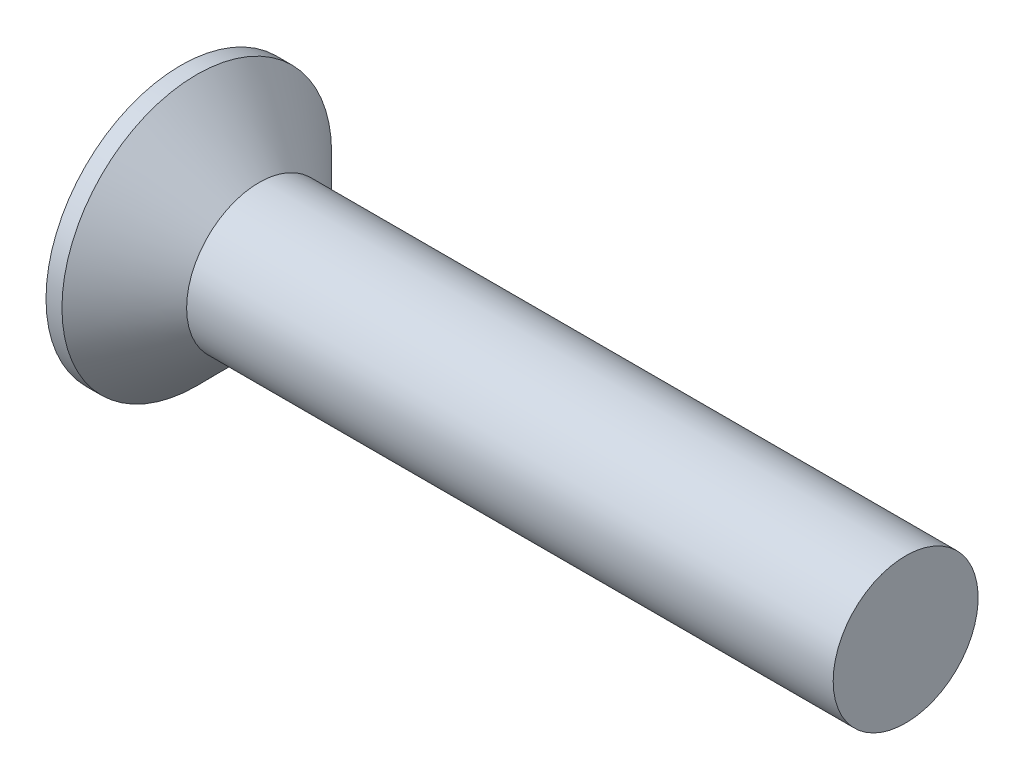
ISO-10303-21;
HEADER;
FILE_DESCRIPTION(('STEP AP214'),'2;1');
FILE_NAME('part.step','',(''),(''),'','','');
FILE_SCHEMA(('AUTOMOTIVE_DESIGN { 1 0 10303 214 1 1 1 1 }'));
ENDSEC;
DATA;
#1=APPLICATION_CONTEXT('core data for automotive mechanical design processes');
#2=APPLICATION_PROTOCOL_DEFINITION('international standard','automotive_design',2000,#1);
#3=PRODUCT_CONTEXT('',#1,'mechanical');
#4=PRODUCT('Part','Part','',(#3));
#5=PRODUCT_RELATED_PRODUCT_CATEGORY('part','',(#4));
#6=PRODUCT_DEFINITION_FORMATION('','',#4);
#7=PRODUCT_DEFINITION_CONTEXT('part definition',#1,'design');
#8=PRODUCT_DEFINITION('design','',#6,#7);
#9=PRODUCT_DEFINITION_SHAPE('','',#8);
#10=(LENGTH_UNIT() NAMED_UNIT(*) SI_UNIT(.MILLI.,.METRE.));
#11=(NAMED_UNIT(*) PLANE_ANGLE_UNIT() SI_UNIT($,.RADIAN.));
#12=(NAMED_UNIT(*) SI_UNIT($,.STERADIAN.) SOLID_ANGLE_UNIT());
#13=UNCERTAINTY_MEASURE_WITH_UNIT(LENGTH_MEASURE(1.E-05),#10,'distance_accuracy_value','');
#14=(GEOMETRIC_REPRESENTATION_CONTEXT(3) GLOBAL_UNCERTAINTY_ASSIGNED_CONTEXT((#13)) GLOBAL_UNIT_ASSIGNED_CONTEXT((#10,
#11,#12)) REPRESENTATION_CONTEXT('',''));
#15=CARTESIAN_POINT('',(0.,0.,0.));
#16=DIRECTION('',(0.,0.,1.));
#17=DIRECTION('',(1.,0.,0.));
#18=AXIS2_PLACEMENT_3D('',#15,#16,#17);
#19=CARTESIAN_POINT('',(0.,0.,0.));
#20=DIRECTION('',(-1.,0.,0.));
#21=DIRECTION('',(0.,0.,1.));
#22=AXIS2_PLACEMENT_3D('',#19,#20,#21);
#23=PLANE('',#22);
#24=CARTESIAN_POINT('',(0.,0.,0.));
#25=DIRECTION('',(-1.,0.,0.));
#26=DIRECTION('',(0.,0.,1.));
#27=AXIS2_PLACEMENT_3D('',#24,#25,#26);
#28=CIRCLE('',#27,4.65);
#29=CARTESIAN_POINT('',(0.,0.,4.65));
#30=VERTEX_POINT('',#29);
#31=EDGE_CURVE('E42',#30,#30,#28,.T.);
#32=ORIENTED_EDGE('',*,*,#31,.T.);
#33=EDGE_LOOP('',(#32));
#34=FACE_BOUND('',#33,.T.);
#35=DIRECTION('',(0.,1.,0.));
#36=VECTOR('',#35,1.);
#37=CARTESIAN_POINT('',(0.,-2.53,-0.52));
#38=LINE('',#37,#36);
#39=CARTESIAN_POINT('',(0.,-2.53,-0.52));
#40=VERTEX_POINT('',#39);
#41=CARTESIAN_POINT('',(0.,-0.519999999999998,-0.52));
#42=VERTEX_POINT('',#41);
#43=EDGE_CURVE('E103',#40,#42,#38,.T.);
#44=ORIENTED_EDGE('',*,*,#43,.T.);
#45=DIRECTION('',(0.,0.,-1.));
#46=VECTOR('',#45,1.);
#47=CARTESIAN_POINT('',(0.,-0.520000000000008,2.53));
#48=LINE('',#47,#46);
#49=CARTESIAN_POINT('',(0.,-0.519999999999991,-2.53));
#50=VERTEX_POINT('',#49);
#51=EDGE_CURVE('E83',#42,#50,#48,.T.);
#52=ORIENTED_EDGE('',*,*,#51,.T.);
#53=DIRECTION('',(0.,1.,0.));
#54=VECTOR('',#53,1.);
#55=CARTESIAN_POINT('',(0.,-0.519999999999991,-2.53));
#56=LINE('',#55,#54);
#57=CARTESIAN_POINT('',(0.,0.520000000000008,-2.53));
#58=VERTEX_POINT('',#57);
#59=EDGE_CURVE('E340',#50,#58,#56,.T.);
#60=ORIENTED_EDGE('',*,*,#59,.T.);
#61=DIRECTION('',(0.,0.,1.));
#62=VECTOR('',#61,1.);
#63=CARTESIAN_POINT('',(0.,0.520000000000008,-2.53));
#64=LINE('',#63,#62);
#65=CARTESIAN_POINT('',(0.,0.520000000000001,-0.52));
#66=VERTEX_POINT('',#65);
#67=EDGE_CURVE('E99',#58,#66,#64,.T.);
#68=ORIENTED_EDGE('',*,*,#67,.T.);
#69=CARTESIAN_POINT('',(0.,2.53,-0.52));
#70=VERTEX_POINT('',#69);
#71=EDGE_CURVE('E93',#66,#70,#38,.T.);
#72=ORIENTED_EDGE('',*,*,#71,.T.);
#73=DIRECTION('',(0.,0.,1.));
#74=VECTOR('',#73,1.);
#75=CARTESIAN_POINT('',(0.,2.53,-0.52));
#76=LINE('',#75,#74);
#77=CARTESIAN_POINT('',(0.,2.53,0.52));
#78=VERTEX_POINT('',#77);
#79=EDGE_CURVE('E96',#70,#78,#76,.T.);
#80=ORIENTED_EDGE('',*,*,#79,.T.);
#81=DIRECTION('',(0.,-1.,0.));
#82=VECTOR('',#81,1.);
#83=CARTESIAN_POINT('',(0.,2.53,0.52));
#84=LINE('',#83,#82);
#85=CARTESIAN_POINT('',(0.,0.519999999999998,0.52));
#86=VERTEX_POINT('',#85);
#87=EDGE_CURVE('E352',#78,#86,#84,.T.);
#88=ORIENTED_EDGE('',*,*,#87,.T.);
#89=CARTESIAN_POINT('',(0.,0.519999999999991,2.53));
#90=VERTEX_POINT('',#89);
#91=EDGE_CURVE('E335',#86,#90,#64,.T.);
#92=ORIENTED_EDGE('',*,*,#91,.T.);
#93=DIRECTION('',(0.,-1.,0.));
#94=VECTOR('',#93,1.);
#95=CARTESIAN_POINT('',(0.,0.519999999999991,2.53));
#96=LINE('',#95,#94);
#97=CARTESIAN_POINT('',(0.,-0.520000000000008,2.53));
#98=VERTEX_POINT('',#97);
#99=EDGE_CURVE('E321',#90,#98,#96,.T.);
#100=ORIENTED_EDGE('',*,*,#99,.T.);
#101=CARTESIAN_POINT('',(0.,-0.520000000000002,0.52));
#102=VERTEX_POINT('',#101);
#103=EDGE_CURVE('E333',#98,#102,#48,.T.);
#104=ORIENTED_EDGE('',*,*,#103,.T.);
#105=CARTESIAN_POINT('',(0.,-2.53,0.52));
#106=VERTEX_POINT('',#105);
#107=EDGE_CURVE('E109',#102,#106,#84,.T.);
#108=ORIENTED_EDGE('',*,*,#107,.T.);
#109=DIRECTION('',(0.,0.,-1.));
#110=VECTOR('',#109,1.);
#111=CARTESIAN_POINT('',(0.,-2.53,0.52));
#112=LINE('',#111,#110);
#113=EDGE_CURVE('E132',#106,#40,#112,.T.);
#114=ORIENTED_EDGE('',*,*,#113,.T.);
#115=EDGE_LOOP('',(#44,#52,#60,#68,#72,#80,#88,#92,#100,#104,#108,#114));
#116=FACE_BOUND('',#115,.T.);
#117=ADVANCED_FACE('F35',(#34,#116),#23,.T.);
#118=CARTESIAN_POINT('',(3.73370044052864,0.,0.230220264317181));
#119=DIRECTION('',(-0.077379238892827,0.,-0.997001731888349));
#120=DIRECTION('',(-0.997001731888349,0.,0.077379238892827));
#121=AXIS2_PLACEMENT_3D('',#118,#119,#120);
#122=PLANE('',#121);
#123=ORIENTED_EDGE('',*,*,#107,.F.);
#124=DIRECTION('',(0.994030271895774,0.0771486181172842,-0.0771486181172839));
#125=VECTOR('',#124,1.);
#126=CARTESIAN_POINT('',(3.75135558639622,-0.228850014190145,0.228850014190144));
#127=LINE('',#126,#125);
#128=CARTESIAN_POINT('',(3.35,-0.260000000000001,0.259999999999999));
#129=VERTEX_POINT('',#128);
#130=EDGE_CURVE('E127',#102,#129,#127,.T.);
#131=ORIENTED_EDGE('',*,*,#130,.T.);
#132=DIRECTION('',(0.826141195234385,0.559803138263299,-0.0641184211226687));
#133=VECTOR('',#132,1.);
#134=CARTESIAN_POINT('',(0.,-2.53,0.52));
#135=LINE('',#134,#133);
#136=EDGE_CURVE('E104',#106,#129,#135,.T.);
#137=ORIENTED_EDGE('',*,*,#136,.F.);
#138=EDGE_LOOP('',(#123,#131,#137));
#139=FACE_BOUND('',#138,.T.);
#140=ADVANCED_FACE('F155',(#139),#122,.T.);
#141=DIRECTION('',(0.826141195234385,-0.559803138263299,-0.0641184211226685));
#142=VECTOR('',#141,1.);
#143=CARTESIAN_POINT('',(0.,2.53,0.52));
#144=LINE('',#143,#142);
#145=CARTESIAN_POINT('',(3.35,0.26,0.26));
#146=VERTEX_POINT('',#145);
#147=EDGE_CURVE('E49',#78,#146,#144,.T.);
#148=ORIENTED_EDGE('',*,*,#147,.T.);
#149=DIRECTION('',(-0.994030271895774,0.0771486181172836,0.0771486181172839));
#150=VECTOR('',#149,1.);
#151=CARTESIAN_POINT('',(3.75135558639622,0.228850014190143,0.228850014190144));
#152=LINE('',#151,#150);
#153=EDGE_CURVE('E348',#146,#86,#152,.T.);
#154=ORIENTED_EDGE('',*,*,#153,.T.);
#155=ORIENTED_EDGE('',*,*,#87,.F.);
#156=EDGE_LOOP('',(#148,#154,#155));
#157=FACE_BOUND('',#156,.T.);
#158=ADVANCED_FACE('F159',(#157),#122,.T.);
#159=CARTESIAN_POINT('',(3.73370044052863,0.,-0.230220264317181));
#160=DIRECTION('',(-0.0773792388928269,0.,0.997001731888349));
#161=DIRECTION('',(0.997001731888349,0.,0.0773792388928269));
#162=AXIS2_PLACEMENT_3D('',#159,#160,#161);
#163=PLANE('',#162);
#164=DIRECTION('',(0.826141195234385,0.559803138263299,0.0641184211226686));
#165=VECTOR('',#164,1.);
#166=CARTESIAN_POINT('',(0.,-2.53,-0.52));
#167=LINE('',#166,#165);
#168=CARTESIAN_POINT('',(3.35,-0.259999999999999,-0.260000000000001));
#169=VERTEX_POINT('',#168);
#170=EDGE_CURVE('E58',#40,#169,#167,.T.);
#171=ORIENTED_EDGE('',*,*,#170,.T.);
#172=DIRECTION('',(-0.994030271895774,-0.0771486181172837,-0.0771486181172839));
#173=VECTOR('',#172,1.);
#174=CARTESIAN_POINT('',(3.75135558639622,-0.228850014190144,-0.228850014190144));
#175=LINE('',#174,#173);
#176=EDGE_CURVE('E11',#169,#42,#175,.T.);
#177=ORIENTED_EDGE('',*,*,#176,.T.);
#178=ORIENTED_EDGE('',*,*,#43,.F.);
#179=EDGE_LOOP('',(#171,#177,#178));
#180=FACE_BOUND('',#179,.T.);
#181=ADVANCED_FACE('F152',(#180),#163,.T.);
#182=ORIENTED_EDGE('',*,*,#71,.F.);
#183=DIRECTION('',(0.994030271895774,-0.0771486181172841,0.0771486181172839));
#184=VECTOR('',#183,1.);
#185=CARTESIAN_POINT('',(3.75135558639622,0.228850014190145,-0.228850014190144));
#186=LINE('',#185,#184);
#187=CARTESIAN_POINT('',(3.35,0.26,-0.26));
#188=VERTEX_POINT('',#187);
#189=EDGE_CURVE('E112',#66,#188,#186,.T.);
#190=ORIENTED_EDGE('',*,*,#189,.T.);
#191=DIRECTION('',(0.826141195234385,-0.5598031382633,0.0641184211226686));
#192=VECTOR('',#191,1.);
#193=CARTESIAN_POINT('',(0.,2.53,-0.52));
#194=LINE('',#193,#192);
#195=EDGE_CURVE('E108',#70,#188,#194,.T.);
#196=ORIENTED_EDGE('',*,*,#195,.F.);
#197=EDGE_LOOP('',(#182,#190,#196));
#198=FACE_BOUND('',#197,.T.);
#199=ADVANCED_FACE('F111',(#198),#163,.T.);
#200=CARTESIAN_POINT('',(-6.34999999999999,0.,0.));
#201=DIRECTION('',(-1.,0.,0.));
#202=DIRECTION('',(0.,0.,1.));
#203=AXIS2_PLACEMENT_3D('',#200,#201,#202);
#204=CYLINDRICAL_SURFACE('',#203,4.65);
#205=CARTESIAN_POINT('',(0.550000000000008,0.,0.));
#206=DIRECTION('',(-1.,0.,0.));
#207=DIRECTION('',(0.,0.,1.));
#208=AXIS2_PLACEMENT_3D('',#205,#206,#207);
#209=CIRCLE('',#208,4.65);
#210=CARTESIAN_POINT('',(0.550000000000008,0.,4.65));
#211=VERTEX_POINT('',#210);
#212=EDGE_CURVE('E135',#211,#211,#209,.T.);
#213=ORIENTED_EDGE('',*,*,#212,.T.);
#214=EDGE_LOOP('',(#213));
#215=FACE_BOUND('',#214,.T.);
#216=ORIENTED_EDGE('',*,*,#31,.F.);
#217=EDGE_LOOP('',(#216));
#218=FACE_BOUND('',#217,.T.);
#219=ADVANCED_FACE('F141',(#215,#218),#204,.T.);
#220=CARTESIAN_POINT('',(0.550000000000008,0.,0.));
#221=DIRECTION('',(-1.,0.,0.));
#222=DIRECTION('',(0.,0.,1.));
#223=AXIS2_PLACEMENT_3D('',#220,#221,#222);
#224=CONICAL_SURFACE('',#223,4.65,0.78539816339745);
#225=CARTESIAN_POINT('',(2.7,0.,0.));
#226=DIRECTION('',(-1.,0.,0.));
#227=DIRECTION('',(0.,0.,1.));
#228=AXIS2_PLACEMENT_3D('',#225,#226,#227);
#229=CIRCLE('',#228,2.5);
#230=CARTESIAN_POINT('',(2.7,0.,2.5));
#231=VERTEX_POINT('',#230);
#232=EDGE_CURVE('E131',#231,#231,#229,.T.);
#233=ORIENTED_EDGE('',*,*,#232,.T.);
#234=EDGE_LOOP('',(#233));
#235=FACE_BOUND('',#234,.T.);
#236=ORIENTED_EDGE('',*,*,#212,.F.);
#237=EDGE_LOOP('',(#236));
#238=FACE_BOUND('',#237,.T.);
#239=ADVANCED_FACE('F143',(#235,#238),#224,.T.);
#240=CARTESIAN_POINT('',(-6.34999999999999,0.,0.));
#241=DIRECTION('',(-1.,0.,0.));
#242=DIRECTION('',(0.,0.,1.));
#243=AXIS2_PLACEMENT_3D('',#240,#241,#242);
#244=CYLINDRICAL_SURFACE('',#243,2.5);
#245=CARTESIAN_POINT('',(25.,0.,0.));
#246=DIRECTION('',(-1.,0.,0.));
#247=DIRECTION('',(0.,0.,1.));
#248=AXIS2_PLACEMENT_3D('',#245,#246,#247);
#249=CIRCLE('',#248,2.5);
#250=CARTESIAN_POINT('',(25.,0.,2.5));
#251=VERTEX_POINT('',#250);
#252=EDGE_CURVE('E128',#251,#251,#249,.T.);
#253=ORIENTED_EDGE('',*,*,#252,.T.);
#254=EDGE_LOOP('',(#253));
#255=FACE_BOUND('',#254,.T.);
#256=ORIENTED_EDGE('',*,*,#232,.F.);
#257=EDGE_LOOP('',(#256));
#258=FACE_BOUND('',#257,.T.);
#259=ADVANCED_FACE('F149',(#255,#258),#244,.T.);
#260=CARTESIAN_POINT('',(25.,2.5,0.));
#261=DIRECTION('',(1.,0.,0.));
#262=DIRECTION('',(0.,0.,-1.));
#263=AXIS2_PLACEMENT_3D('',#260,#261,#262);
#264=PLANE('',#263);
#265=ORIENTED_EDGE('',*,*,#252,.F.);
#266=EDGE_LOOP('',(#265));
#267=FACE_BOUND('',#266,.T.);
#268=ADVANCED_FACE('F179',(#267),#264,.T.);
#269=CARTESIAN_POINT('',(3.35,0.26,-0.26));
#270=DIRECTION('',(1.,0.,0.));
#271=DIRECTION('',(0.,0.,-1.));
#272=AXIS2_PLACEMENT_3D('',#269,#270,#271);
#273=PLANE('',#272);
#274=DIRECTION('',(0.,1.,0.));
#275=VECTOR('',#274,1.);
#276=CARTESIAN_POINT('',(3.35,-0.26,-0.26));
#277=LINE('',#276,#275);
#278=EDGE_CURVE('E123',#169,#188,#277,.T.);
#279=ORIENTED_EDGE('',*,*,#278,.F.);
#280=DIRECTION('',(0.,0.,-1.));
#281=VECTOR('',#280,1.);
#282=CARTESIAN_POINT('',(3.35,-0.26,0.26));
#283=LINE('',#282,#281);
#284=EDGE_CURVE('E114',#129,#169,#283,.T.);
#285=ORIENTED_EDGE('',*,*,#284,.F.);
#286=DIRECTION('',(0.,-1.,0.));
#287=VECTOR('',#286,1.);
#288=CARTESIAN_POINT('',(3.35,0.26,0.26));
#289=LINE('',#288,#287);
#290=EDGE_CURVE('E117',#146,#129,#289,.T.);
#291=ORIENTED_EDGE('',*,*,#290,.F.);
#292=DIRECTION('',(0.,0.,1.));
#293=VECTOR('',#292,1.);
#294=CARTESIAN_POINT('',(3.35,0.26,-0.26));
#295=LINE('',#294,#293);
#296=EDGE_CURVE('E121',#188,#146,#295,.T.);
#297=ORIENTED_EDGE('',*,*,#296,.F.);
#298=EDGE_LOOP('',(#279,#285,#291,#297));
#299=FACE_BOUND('',#298,.T.);
#300=ADVANCED_FACE('F176',(#299),#273,.F.);
#301=CARTESIAN_POINT('',(0.,-2.53,-0.52));
#302=DIRECTION('',(-0.560957422052894,0.827844653690396,0.));
#303=DIRECTION('',(-0.827844653690396,-0.560957422052894,0.));
#304=AXIS2_PLACEMENT_3D('',#301,#302,#303);
#305=PLANE('',#304);
#306=ORIENTED_EDGE('',*,*,#170,.F.);
#307=ORIENTED_EDGE('',*,*,#113,.F.);
#308=ORIENTED_EDGE('',*,*,#136,.T.);
#309=ORIENTED_EDGE('',*,*,#284,.T.);
#310=EDGE_LOOP('',(#306,#307,#308,#309));
#311=FACE_BOUND('',#310,.T.);
#312=ADVANCED_FACE('F168',(#311),#305,.T.);
#313=CARTESIAN_POINT('',(0.,2.53,0.52));
#314=DIRECTION('',(-0.560957422052895,-0.827844653690396,0.));
#315=DIRECTION('',(0.827844653690396,-0.560957422052895,0.));
#316=AXIS2_PLACEMENT_3D('',#313,#314,#315);
#317=PLANE('',#316);
#318=ORIENTED_EDGE('',*,*,#147,.F.);
#319=ORIENTED_EDGE('',*,*,#79,.F.);
#320=ORIENTED_EDGE('',*,*,#195,.T.);
#321=ORIENTED_EDGE('',*,*,#296,.T.);
#322=EDGE_LOOP('',(#318,#319,#320,#321));
#323=FACE_BOUND('',#322,.T.);
#324=ADVANCED_FACE('F107',(#323),#317,.T.);
#325=CARTESIAN_POINT('',(3.73370044052864,-0.230220264317181,0.));
#326=DIRECTION('',(-0.077379238892827,0.997001731888349,0.));
#327=DIRECTION('',(-0.997001731888349,-0.077379238892827,0.));
#328=AXIS2_PLACEMENT_3D('',#325,#326,#327);
#329=PLANE('',#328);
#330=DIRECTION('',(0.826141195234385,0.0641184211226667,0.559803138263299));
#331=VECTOR('',#330,1.);
#332=CARTESIAN_POINT('',(0.,-0.519999999999991,-2.53));
#333=LINE('',#332,#331);
#334=EDGE_CURVE('E342',#50,#169,#333,.T.);
#335=ORIENTED_EDGE('',*,*,#334,.F.);
#336=ORIENTED_EDGE('',*,*,#51,.F.);
#337=ORIENTED_EDGE('',*,*,#176,.F.);
#338=EDGE_LOOP('',(#335,#336,#337));
#339=FACE_BOUND('',#338,.T.);
#340=ADVANCED_FACE('F175',(#339),#329,.T.);
#341=CARTESIAN_POINT('',(3.73370044052863,0.230220264317181,0.));
#342=DIRECTION('',(-0.0773792388928269,-0.997001731888349,0.));
#343=DIRECTION('',(0.997001731888349,-0.0773792388928269,0.));
#344=AXIS2_PLACEMENT_3D('',#341,#342,#343);
#345=PLANE('',#344);
#346=ORIENTED_EDGE('',*,*,#67,.F.);
#347=DIRECTION('',(0.826141195234385,-0.0641184211226705,0.559803138263299));
#348=VECTOR('',#347,1.);
#349=CARTESIAN_POINT('',(0.,0.520000000000008,-2.53));
#350=LINE('',#349,#348);
#351=EDGE_CURVE('E74',#58,#188,#350,.T.);
#352=ORIENTED_EDGE('',*,*,#351,.T.);
#353=ORIENTED_EDGE('',*,*,#189,.F.);
#354=EDGE_LOOP('',(#346,#352,#353));
#355=FACE_BOUND('',#354,.T.);
#356=ADVANCED_FACE('F219',(#355),#345,.T.);
#357=CARTESIAN_POINT('',(0.,0.520000000000008,-2.53));
#358=DIRECTION('',(-0.560957422052894,0.,0.827844653690396));
#359=DIRECTION('',(-0.827844653690396,0.,-0.560957422052894));
#360=AXIS2_PLACEMENT_3D('',#357,#358,#359);
#361=PLANE('',#360);
#362=ORIENTED_EDGE('',*,*,#351,.F.);
#363=ORIENTED_EDGE('',*,*,#59,.F.);
#364=ORIENTED_EDGE('',*,*,#334,.T.);
#365=ORIENTED_EDGE('',*,*,#278,.T.);
#366=EDGE_LOOP('',(#362,#363,#364,#365));
#367=FACE_BOUND('',#366,.T.);
#368=ADVANCED_FACE('F227',(#367),#361,.T.);
#369=ORIENTED_EDGE('',*,*,#103,.F.);
#370=DIRECTION('',(0.826141195234385,0.0641184211226705,-0.559803138263299));
#371=VECTOR('',#370,1.);
#372=CARTESIAN_POINT('',(0.,-0.520000000000008,2.53));
#373=LINE('',#372,#371);
#374=EDGE_CURVE('E318',#98,#129,#373,.T.);
#375=ORIENTED_EDGE('',*,*,#374,.T.);
#376=ORIENTED_EDGE('',*,*,#130,.F.);
#377=EDGE_LOOP('',(#369,#375,#376));
#378=FACE_BOUND('',#377,.T.);
#379=ADVANCED_FACE('F221',(#378),#329,.T.);
#380=DIRECTION('',(0.826141195234385,-0.0641184211226666,-0.5598031382633));
#381=VECTOR('',#380,1.);
#382=CARTESIAN_POINT('',(0.,0.519999999999991,2.53));
#383=LINE('',#382,#381);
#384=EDGE_CURVE('E329',#90,#146,#383,.T.);
#385=ORIENTED_EDGE('',*,*,#384,.F.);
#386=ORIENTED_EDGE('',*,*,#91,.F.);
#387=ORIENTED_EDGE('',*,*,#153,.F.);
#388=EDGE_LOOP('',(#385,#386,#387));
#389=FACE_BOUND('',#388,.T.);
#390=ADVANCED_FACE('F229',(#389),#345,.T.);
#391=CARTESIAN_POINT('',(0.,-0.520000000000008,2.53));
#392=DIRECTION('',(-0.560957422052895,0.,-0.827844653690396));
#393=DIRECTION('',(0.827844653690396,0.,-0.560957422052895));
#394=AXIS2_PLACEMENT_3D('',#391,#392,#393);
#395=PLANE('',#394);
#396=ORIENTED_EDGE('',*,*,#374,.F.);
#397=ORIENTED_EDGE('',*,*,#99,.F.);
#398=ORIENTED_EDGE('',*,*,#384,.T.);
#399=ORIENTED_EDGE('',*,*,#290,.T.);
#400=EDGE_LOOP('',(#396,#397,#398,#399));
#401=FACE_BOUND('',#400,.T.);
#402=ADVANCED_FACE('F248',(#401),#395,.T.);
#403=CLOSED_SHELL('',(#117,#140,#158,#181,#199,#219,#239,#259,#268,#300,#312,#324,#340,#356,
#368,#379,#390,#402));
#404=MANIFOLD_SOLID_BREP('B2',#403);
#405=ADVANCED_BREP_SHAPE_REPRESENTATION('',(#18,#404),#14);
#406=SHAPE_DEFINITION_REPRESENTATION(#9,#405);
ENDSEC;
END-ISO-10303-21;
